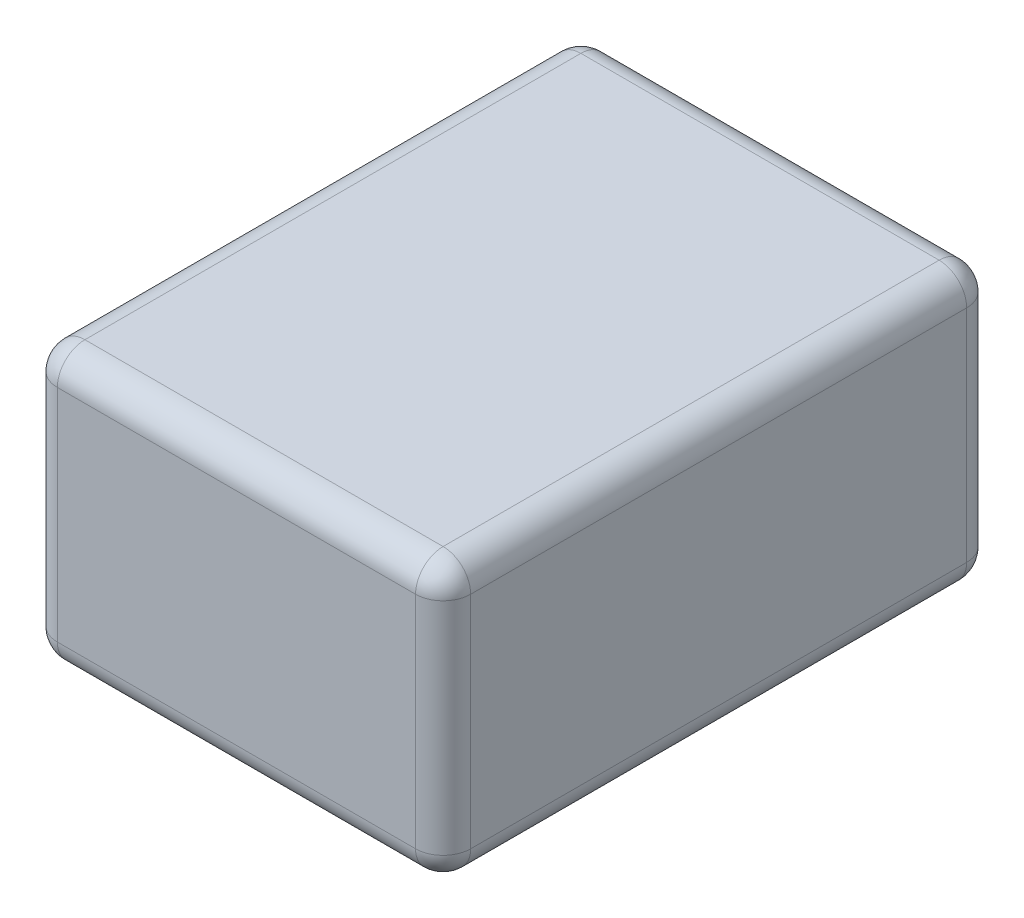
ISO-10303-21;
HEADER;
FILE_DESCRIPTION(('STEP AP214'),'2;1');
FILE_NAME('part.step','',(''),(''),'','','');
FILE_SCHEMA(('AUTOMOTIVE_DESIGN { 1 0 10303 214 1 1 1 1 }'));
ENDSEC;
DATA;
#1=APPLICATION_CONTEXT('core data for automotive mechanical design processes');
#2=APPLICATION_PROTOCOL_DEFINITION('international standard','automotive_design',2000,#1);
#3=PRODUCT_CONTEXT('',#1,'mechanical');
#4=PRODUCT('Part','Part','',(#3));
#5=PRODUCT_RELATED_PRODUCT_CATEGORY('part','',(#4));
#6=PRODUCT_DEFINITION_FORMATION('','',#4);
#7=PRODUCT_DEFINITION_CONTEXT('part definition',#1,'design');
#8=PRODUCT_DEFINITION('design','',#6,#7);
#9=PRODUCT_DEFINITION_SHAPE('','',#8);
#10=(LENGTH_UNIT() NAMED_UNIT(*) SI_UNIT(.MILLI.,.METRE.));
#11=(NAMED_UNIT(*) PLANE_ANGLE_UNIT() SI_UNIT($,.RADIAN.));
#12=(NAMED_UNIT(*) SI_UNIT($,.STERADIAN.) SOLID_ANGLE_UNIT());
#13=UNCERTAINTY_MEASURE_WITH_UNIT(LENGTH_MEASURE(1.E-05),#10,'distance_accuracy_value','');
#14=(GEOMETRIC_REPRESENTATION_CONTEXT(3) GLOBAL_UNCERTAINTY_ASSIGNED_CONTEXT((#13)) GLOBAL_UNIT_ASSIGNED_CONTEXT((#10,
#11,#12)) REPRESENTATION_CONTEXT('',''));
#15=CARTESIAN_POINT('',(0.,0.,0.));
#16=DIRECTION('',(0.,0.,1.));
#17=DIRECTION('',(1.,0.,0.));
#18=AXIS2_PLACEMENT_3D('',#15,#16,#17);
#19=CARTESIAN_POINT('',(15.,10.,40.));
#20=DIRECTION('',(-1.,0.,0.));
#21=DIRECTION('',(0.,0.,1.));
#22=AXIS2_PLACEMENT_3D('',#19,#20,#21);
#23=PLANE('',#22);
#24=DIRECTION('',(0.,1.,0.));
#25=VECTOR('',#24,1.);
#26=CARTESIAN_POINT('',(15.,-10.,38.));
#27=LINE('',#26,#25);
#28=CARTESIAN_POINT('',(15.,8.,38.));
#29=VERTEX_POINT('',#28);
#30=CARTESIAN_POINT('',(15.,-8.,38.));
#31=VERTEX_POINT('',#30);
#32=EDGE_CURVE('E136',#29,#31,#27,.F.);
#33=ORIENTED_EDGE('',*,*,#32,.T.);
#34=DIRECTION('',(0.,0.,-1.));
#35=VECTOR('',#34,1.);
#36=CARTESIAN_POINT('',(15.,-8.,40.));
#37=LINE('',#36,#35);
#38=CARTESIAN_POINT('',(15.,-8.,2.));
#39=VERTEX_POINT('',#38);
#40=EDGE_CURVE('E132',#31,#39,#37,.T.);
#41=ORIENTED_EDGE('',*,*,#40,.T.);
#42=DIRECTION('',(0.,1.,0.));
#43=VECTOR('',#42,1.);
#44=CARTESIAN_POINT('',(15.,10.,2.));
#45=LINE('',#44,#43);
#46=CARTESIAN_POINT('',(15.,8.,2.));
#47=VERTEX_POINT('',#46);
#48=EDGE_CURVE('E127',#39,#47,#45,.T.);
#49=ORIENTED_EDGE('',*,*,#48,.T.);
#50=DIRECTION('',(0.,0.,-1.));
#51=VECTOR('',#50,1.);
#52=CARTESIAN_POINT('',(15.,8.,40.));
#53=LINE('',#52,#51);
#54=EDGE_CURVE('E129',#47,#29,#53,.F.);
#55=ORIENTED_EDGE('',*,*,#54,.T.);
#56=EDGE_LOOP('',(#33,#41,#49,#55));
#57=FACE_BOUND('',#56,.T.);
#58=ADVANCED_FACE('F36',(#57),#23,.F.);
#59=CARTESIAN_POINT('',(-15.,10.,40.));
#60=DIRECTION('',(0.,-1.,0.));
#61=DIRECTION('',(0.,0.,-1.));
#62=AXIS2_PLACEMENT_3D('',#59,#60,#61);
#63=PLANE('',#62);
#64=DIRECTION('',(0.,0.,-1.));
#65=VECTOR('',#64,1.);
#66=CARTESIAN_POINT('',(13.,10.,40.));
#67=LINE('',#66,#65);
#68=CARTESIAN_POINT('',(13.,10.,38.));
#69=VERTEX_POINT('',#68);
#70=CARTESIAN_POINT('',(13.,10.,2.));
#71=VERTEX_POINT('',#70);
#72=EDGE_CURVE('E246',#69,#71,#67,.T.);
#73=ORIENTED_EDGE('',*,*,#72,.T.);
#74=DIRECTION('',(-1.,0.,0.));
#75=VECTOR('',#74,1.);
#76=CARTESIAN_POINT('',(-15.,10.,2.));
#77=LINE('',#76,#75);
#78=CARTESIAN_POINT('',(-13.,10.,2.));
#79=VERTEX_POINT('',#78);
#80=EDGE_CURVE('E11',#71,#79,#77,.T.);
#81=ORIENTED_EDGE('',*,*,#80,.T.);
#82=DIRECTION('',(0.,0.,-1.));
#83=VECTOR('',#82,1.);
#84=CARTESIAN_POINT('',(-13.,10.,40.));
#85=LINE('',#84,#83);
#86=CARTESIAN_POINT('',(-13.,10.,38.));
#87=VERTEX_POINT('',#86);
#88=EDGE_CURVE('E45',#79,#87,#85,.F.);
#89=ORIENTED_EDGE('',*,*,#88,.T.);
#90=DIRECTION('',(-1.,0.,0.));
#91=VECTOR('',#90,1.);
#92=CARTESIAN_POINT('',(15.,10.,38.));
#93=LINE('',#92,#91);
#94=EDGE_CURVE('E248',#87,#69,#93,.F.);
#95=ORIENTED_EDGE('',*,*,#94,.T.);
#96=EDGE_LOOP('',(#73,#81,#89,#95));
#97=FACE_BOUND('',#96,.T.);
#98=ADVANCED_FACE('F307',(#97),#63,.F.);
#99=CARTESIAN_POINT('',(-15.,10.,40.));
#100=DIRECTION('',(1.,0.,0.));
#101=DIRECTION('',(0.,0.,-1.));
#102=AXIS2_PLACEMENT_3D('',#99,#100,#101);
#103=PLANE('',#102);
#104=DIRECTION('',(0.,0.,-1.));
#105=VECTOR('',#104,1.);
#106=CARTESIAN_POINT('',(-15.,8.,40.));
#107=LINE('',#106,#105);
#108=CARTESIAN_POINT('',(-15.,8.,38.));
#109=VERTEX_POINT('',#108);
#110=CARTESIAN_POINT('',(-15.,8.,2.));
#111=VERTEX_POINT('',#110);
#112=EDGE_CURVE('E230',#109,#111,#107,.T.);
#113=ORIENTED_EDGE('',*,*,#112,.T.);
#114=DIRECTION('',(0.,-1.,0.));
#115=VECTOR('',#114,1.);
#116=CARTESIAN_POINT('',(-15.,10.,2.));
#117=LINE('',#116,#115);
#118=CARTESIAN_POINT('',(-15.,-8.,2.));
#119=VERTEX_POINT('',#118);
#120=EDGE_CURVE('E235',#111,#119,#117,.T.);
#121=ORIENTED_EDGE('',*,*,#120,.T.);
#122=DIRECTION('',(0.,0.,-1.));
#123=VECTOR('',#122,1.);
#124=CARTESIAN_POINT('',(-15.,-8.,40.));
#125=LINE('',#124,#123);
#126=CARTESIAN_POINT('',(-15.,-8.,38.));
#127=VERTEX_POINT('',#126);
#128=EDGE_CURVE('E233',#119,#127,#125,.F.);
#129=ORIENTED_EDGE('',*,*,#128,.T.);
#130=DIRECTION('',(0.,-1.,0.));
#131=VECTOR('',#130,1.);
#132=CARTESIAN_POINT('',(-15.,10.,38.));
#133=LINE('',#132,#131);
#134=EDGE_CURVE('E214',#127,#109,#133,.F.);
#135=ORIENTED_EDGE('',*,*,#134,.T.);
#136=EDGE_LOOP('',(#113,#121,#129,#135));
#137=FACE_BOUND('',#136,.T.);
#138=ADVANCED_FACE('F304',(#137),#103,.F.);
#139=CARTESIAN_POINT('',(-15.,-10.,40.));
#140=DIRECTION('',(0.,1.,0.));
#141=DIRECTION('',(0.,0.,1.));
#142=AXIS2_PLACEMENT_3D('',#139,#140,#141);
#143=PLANE('',#142);
#144=DIRECTION('',(1.,0.,0.));
#145=VECTOR('',#144,1.);
#146=CARTESIAN_POINT('',(-15.,-10.,2.));
#147=LINE('',#146,#145);
#148=CARTESIAN_POINT('',(-13.,-10.,2.));
#149=VERTEX_POINT('',#148);
#150=CARTESIAN_POINT('',(13.,-10.,2.));
#151=VERTEX_POINT('',#150);
#152=EDGE_CURVE('E277',#149,#151,#147,.T.);
#153=ORIENTED_EDGE('',*,*,#152,.T.);
#154=DIRECTION('',(0.,0.,-1.));
#155=VECTOR('',#154,1.);
#156=CARTESIAN_POINT('',(13.,-10.,40.));
#157=LINE('',#156,#155);
#158=CARTESIAN_POINT('',(13.,-10.,38.));
#159=VERTEX_POINT('',#158);
#160=EDGE_CURVE('E225',#151,#159,#157,.F.);
#161=ORIENTED_EDGE('',*,*,#160,.T.);
#162=DIRECTION('',(1.,0.,0.));
#163=VECTOR('',#162,1.);
#164=CARTESIAN_POINT('',(-15.,-10.,38.));
#165=LINE('',#164,#163);
#166=CARTESIAN_POINT('',(-13.,-10.,38.));
#167=VERTEX_POINT('',#166);
#168=EDGE_CURVE('E272',#159,#167,#165,.F.);
#169=ORIENTED_EDGE('',*,*,#168,.T.);
#170=DIRECTION('',(0.,0.,-1.));
#171=VECTOR('',#170,1.);
#172=CARTESIAN_POINT('',(-13.,-10.,40.));
#173=LINE('',#172,#171);
#174=EDGE_CURVE('E287',#167,#149,#173,.T.);
#175=ORIENTED_EDGE('',*,*,#174,.T.);
#176=EDGE_LOOP('',(#153,#161,#169,#175));
#177=FACE_BOUND('',#176,.T.);
#178=ADVANCED_FACE('F280',(#177),#143,.F.);
#179=CARTESIAN_POINT('',(0.,0.,40.));
#180=DIRECTION('',(0.,0.,1.));
#181=DIRECTION('',(1.,0.,0.));
#182=AXIS2_PLACEMENT_3D('',#179,#180,#181);
#183=PLANE('',#182);
#184=DIRECTION('',(0.,-1.,0.));
#185=VECTOR('',#184,1.);
#186=CARTESIAN_POINT('',(-13.,-10.,40.));
#187=LINE('',#186,#185);
#188=CARTESIAN_POINT('',(-13.,8.,40.));
#189=VERTEX_POINT('',#188);
#190=CARTESIAN_POINT('',(-13.,-8.,40.));
#191=VERTEX_POINT('',#190);
#192=EDGE_CURVE('E216',#189,#191,#187,.T.);
#193=ORIENTED_EDGE('',*,*,#192,.T.);
#194=DIRECTION('',(1.,0.,0.));
#195=VECTOR('',#194,1.);
#196=CARTESIAN_POINT('',(15.,-8.,40.));
#197=LINE('',#196,#195);
#198=CARTESIAN_POINT('',(13.,-8.,40.));
#199=VERTEX_POINT('',#198);
#200=EDGE_CURVE('E223',#191,#199,#197,.T.);
#201=ORIENTED_EDGE('',*,*,#200,.T.);
#202=DIRECTION('',(0.,1.,0.));
#203=VECTOR('',#202,1.);
#204=CARTESIAN_POINT('',(13.,10.,40.));
#205=LINE('',#204,#203);
#206=CARTESIAN_POINT('',(13.,8.,40.));
#207=VERTEX_POINT('',#206);
#208=EDGE_CURVE('E220',#199,#207,#205,.T.);
#209=ORIENTED_EDGE('',*,*,#208,.T.);
#210=DIRECTION('',(-1.,0.,0.));
#211=VECTOR('',#210,1.);
#212=CARTESIAN_POINT('',(-15.,8.,40.));
#213=LINE('',#212,#211);
#214=EDGE_CURVE('E221',#207,#189,#213,.T.);
#215=ORIENTED_EDGE('',*,*,#214,.T.);
#216=EDGE_LOOP('',(#193,#201,#209,#215));
#217=FACE_BOUND('',#216,.T.);
#218=ADVANCED_FACE('F294',(#217),#183,.T.);
#219=CARTESIAN_POINT('',(0.,0.,0.));
#220=DIRECTION('',(0.,0.,1.));
#221=DIRECTION('',(1.,0.,0.));
#222=AXIS2_PLACEMENT_3D('',#219,#220,#221);
#223=PLANE('',#222);
#224=DIRECTION('',(1.,0.,0.));
#225=VECTOR('',#224,1.);
#226=CARTESIAN_POINT('',(0.,-8.,0.));
#227=LINE('',#226,#225);
#228=CARTESIAN_POINT('',(13.,-8.,0.));
#229=VERTEX_POINT('',#228);
#230=CARTESIAN_POINT('',(-13.,-8.,0.));
#231=VERTEX_POINT('',#230);
#232=EDGE_CURVE('E241',#229,#231,#227,.F.);
#233=ORIENTED_EDGE('',*,*,#232,.T.);
#234=DIRECTION('',(0.,-1.,0.));
#235=VECTOR('',#234,1.);
#236=CARTESIAN_POINT('',(-13.,0.,0.));
#237=LINE('',#236,#235);
#238=CARTESIAN_POINT('',(-13.,8.,0.));
#239=VERTEX_POINT('',#238);
#240=EDGE_CURVE('E243',#231,#239,#237,.F.);
#241=ORIENTED_EDGE('',*,*,#240,.T.);
#242=DIRECTION('',(-1.,0.,0.));
#243=VECTOR('',#242,1.);
#244=CARTESIAN_POINT('',(0.,8.,0.));
#245=LINE('',#244,#243);
#246=CARTESIAN_POINT('',(13.,8.,0.));
#247=VERTEX_POINT('',#246);
#248=EDGE_CURVE('E239',#239,#247,#245,.F.);
#249=ORIENTED_EDGE('',*,*,#248,.T.);
#250=DIRECTION('',(0.,1.,0.));
#251=VECTOR('',#250,1.);
#252=CARTESIAN_POINT('',(13.,0.,0.));
#253=LINE('',#252,#251);
#254=EDGE_CURVE('E158',#247,#229,#253,.F.);
#255=ORIENTED_EDGE('',*,*,#254,.T.);
#256=EDGE_LOOP('',(#233,#241,#249,#255));
#257=FACE_BOUND('',#256,.T.);
#258=ADVANCED_FACE('F296',(#257),#223,.F.);
#259=CARTESIAN_POINT('',(-13.,8.,40.));
#260=DIRECTION('',(0.,0.,-1.));
#261=DIRECTION('',(-1.,0.,0.));
#262=AXIS2_PLACEMENT_3D('',#259,#260,#261);
#263=CYLINDRICAL_SURFACE('',#262,2.);
#264=CARTESIAN_POINT('',(-13.,8.,38.));
#265=DIRECTION('',(0.,0.,1.));
#266=DIRECTION('',(1.,0.,0.));
#267=AXIS2_PLACEMENT_3D('',#264,#265,#266);
#268=CIRCLE('',#267,2.);
#269=EDGE_CURVE('E40',#87,#109,#268,.T.);
#270=ORIENTED_EDGE('',*,*,#269,.F.);
#271=ORIENTED_EDGE('',*,*,#88,.F.);
#272=CARTESIAN_POINT('',(-13.,8.,2.));
#273=DIRECTION('',(0.,0.,-1.));
#274=DIRECTION('',(-1.,0.,0.));
#275=AXIS2_PLACEMENT_3D('',#272,#273,#274);
#276=CIRCLE('',#275,2.);
#277=EDGE_CURVE('E197',#111,#79,#276,.T.);
#278=ORIENTED_EDGE('',*,*,#277,.F.);
#279=ORIENTED_EDGE('',*,*,#112,.F.);
#280=EDGE_LOOP('',(#270,#271,#278,#279));
#281=FACE_BOUND('',#280,.T.);
#282=ADVANCED_FACE('F38',(#281),#263,.T.);
#283=CARTESIAN_POINT('',(-13.,8.,38.));
#284=DIRECTION('',(0.,0.,1.));
#285=DIRECTION('',(1.,0.,0.));
#286=AXIS2_PLACEMENT_3D('',#283,#284,#285);
#287=SPHERICAL_SURFACE('',#286,2.);
#288=CARTESIAN_POINT('',(-13.,8.,38.));
#289=DIRECTION('',(-1.,0.,0.));
#290=DIRECTION('',(0.,0.,1.));
#291=AXIS2_PLACEMENT_3D('',#288,#289,#290);
#292=CIRCLE('',#291,2.);
#293=EDGE_CURVE('E192',#87,#189,#292,.F.);
#294=ORIENTED_EDGE('',*,*,#293,.F.);
#295=ORIENTED_EDGE('',*,*,#269,.T.);
#296=CARTESIAN_POINT('',(-13.,8.,38.));
#297=DIRECTION('',(0.,1.,0.));
#298=DIRECTION('',(0.,0.,1.));
#299=AXIS2_PLACEMENT_3D('',#296,#297,#298);
#300=CIRCLE('',#299,2.);
#301=EDGE_CURVE('E195',#189,#109,#300,.F.);
#302=ORIENTED_EDGE('',*,*,#301,.F.);
#303=EDGE_LOOP('',(#294,#295,#302));
#304=FACE_BOUND('',#303,.T.);
#305=ADVANCED_FACE('F205',(#304),#287,.T.);
#306=CARTESIAN_POINT('',(-13.,8.,2.));
#307=DIRECTION('',(0.,0.,1.));
#308=DIRECTION('',(1.,0.,0.));
#309=AXIS2_PLACEMENT_3D('',#306,#307,#308);
#310=SPHERICAL_SURFACE('',#309,2.);
#311=CARTESIAN_POINT('',(-13.,8.,2.));
#312=DIRECTION('',(0.,1.,0.));
#313=DIRECTION('',(0.,0.,1.));
#314=AXIS2_PLACEMENT_3D('',#311,#312,#313);
#315=CIRCLE('',#314,2.);
#316=EDGE_CURVE('E188',#111,#239,#315,.F.);
#317=ORIENTED_EDGE('',*,*,#316,.F.);
#318=ORIENTED_EDGE('',*,*,#277,.T.);
#319=CARTESIAN_POINT('',(-13.,8.,2.));
#320=DIRECTION('',(-1.,0.,0.));
#321=DIRECTION('',(0.,0.,1.));
#322=AXIS2_PLACEMENT_3D('',#319,#320,#321);
#323=CIRCLE('',#322,2.);
#324=EDGE_CURVE('E53',#239,#79,#323,.F.);
#325=ORIENTED_EDGE('',*,*,#324,.F.);
#326=EDGE_LOOP('',(#317,#318,#325));
#327=FACE_BOUND('',#326,.T.);
#328=ADVANCED_FACE('F367',(#327),#310,.T.);
#329=CARTESIAN_POINT('',(-13.,0.,38.));
#330=DIRECTION('',(0.,1.,0.));
#331=DIRECTION('',(0.,0.,1.));
#332=AXIS2_PLACEMENT_3D('',#329,#330,#331);
#333=CYLINDRICAL_SURFACE('',#332,2.);
#334=ORIENTED_EDGE('',*,*,#301,.T.);
#335=ORIENTED_EDGE('',*,*,#134,.F.);
#336=CARTESIAN_POINT('',(-13.,-8.,38.));
#337=DIRECTION('',(0.,-1.,0.));
#338=DIRECTION('',(0.,0.,-1.));
#339=AXIS2_PLACEMENT_3D('',#336,#337,#338);
#340=CIRCLE('',#339,2.);
#341=EDGE_CURVE('E182',#191,#127,#340,.T.);
#342=ORIENTED_EDGE('',*,*,#341,.F.);
#343=ORIENTED_EDGE('',*,*,#192,.F.);
#344=EDGE_LOOP('',(#334,#335,#342,#343));
#345=FACE_BOUND('',#344,.T.);
#346=ADVANCED_FACE('F212',(#345),#333,.T.);
#347=CARTESIAN_POINT('',(0.,8.,38.));
#348=DIRECTION('',(1.,0.,0.));
#349=DIRECTION('',(0.,0.,-1.));
#350=AXIS2_PLACEMENT_3D('',#347,#348,#349);
#351=CYLINDRICAL_SURFACE('',#350,2.);
#352=ORIENTED_EDGE('',*,*,#293,.T.);
#353=ORIENTED_EDGE('',*,*,#214,.F.);
#354=CARTESIAN_POINT('',(13.,8.,38.));
#355=DIRECTION('',(1.,0.,0.));
#356=DIRECTION('',(0.,0.,-1.));
#357=AXIS2_PLACEMENT_3D('',#354,#355,#356);
#358=CIRCLE('',#357,2.);
#359=EDGE_CURVE('E179',#69,#207,#358,.T.);
#360=ORIENTED_EDGE('',*,*,#359,.F.);
#361=ORIENTED_EDGE('',*,*,#94,.F.);
#362=EDGE_LOOP('',(#352,#353,#360,#361));
#363=FACE_BOUND('',#362,.T.);
#364=ADVANCED_FACE('F361',(#363),#351,.T.);
#365=CARTESIAN_POINT('',(13.,8.,40.));
#366=DIRECTION('',(0.,0.,-1.));
#367=DIRECTION('',(-1.,0.,0.));
#368=AXIS2_PLACEMENT_3D('',#365,#366,#367);
#369=CYLINDRICAL_SURFACE('',#368,2.);
#370=CARTESIAN_POINT('',(13.,8.,2.));
#371=DIRECTION('',(0.,0.,-1.));
#372=DIRECTION('',(-1.,0.,0.));
#373=AXIS2_PLACEMENT_3D('',#370,#371,#372);
#374=CIRCLE('',#373,2.);
#375=EDGE_CURVE('E143',#71,#47,#374,.T.);
#376=ORIENTED_EDGE('',*,*,#375,.F.);
#377=ORIENTED_EDGE('',*,*,#72,.F.);
#378=CARTESIAN_POINT('',(13.,8.,38.));
#379=DIRECTION('',(0.,0.,1.));
#380=DIRECTION('',(1.,0.,0.));
#381=AXIS2_PLACEMENT_3D('',#378,#379,#380);
#382=CIRCLE('',#381,2.);
#383=EDGE_CURVE('E146',#29,#69,#382,.T.);
#384=ORIENTED_EDGE('',*,*,#383,.F.);
#385=ORIENTED_EDGE('',*,*,#54,.F.);
#386=EDGE_LOOP('',(#376,#377,#384,#385));
#387=FACE_BOUND('',#386,.T.);
#388=ADVANCED_FACE('F141',(#387),#369,.T.);
#389=CARTESIAN_POINT('',(-15.,8.,2.));
#390=DIRECTION('',(-1.,0.,0.));
#391=DIRECTION('',(0.,0.,1.));
#392=AXIS2_PLACEMENT_3D('',#389,#390,#391);
#393=CYLINDRICAL_SURFACE('',#392,2.);
#394=ORIENTED_EDGE('',*,*,#324,.T.);
#395=ORIENTED_EDGE('',*,*,#80,.F.);
#396=CARTESIAN_POINT('',(13.,8.,2.));
#397=DIRECTION('',(1.,0.,0.));
#398=DIRECTION('',(0.,1.,0.));
#399=AXIS2_PLACEMENT_3D('',#396,#397,#398);
#400=CIRCLE('',#399,2.);
#401=EDGE_CURVE('E155',#247,#71,#400,.T.);
#402=ORIENTED_EDGE('',*,*,#401,.F.);
#403=ORIENTED_EDGE('',*,*,#248,.F.);
#404=EDGE_LOOP('',(#394,#395,#402,#403));
#405=FACE_BOUND('',#404,.T.);
#406=ADVANCED_FACE('F355',(#405),#393,.T.);
#407=CARTESIAN_POINT('',(-13.,10.,2.));
#408=DIRECTION('',(0.,-1.,0.));
#409=DIRECTION('',(0.,0.,-1.));
#410=AXIS2_PLACEMENT_3D('',#407,#408,#409);
#411=CYLINDRICAL_SURFACE('',#410,2.);
#412=ORIENTED_EDGE('',*,*,#316,.T.);
#413=ORIENTED_EDGE('',*,*,#240,.F.);
#414=CARTESIAN_POINT('',(-13.,-8.,2.));
#415=DIRECTION('',(0.,-1.,0.));
#416=DIRECTION('',(0.,0.,-1.));
#417=AXIS2_PLACEMENT_3D('',#414,#415,#416);
#418=CIRCLE('',#417,2.);
#419=EDGE_CURVE('E174',#119,#231,#418,.T.);
#420=ORIENTED_EDGE('',*,*,#419,.F.);
#421=ORIENTED_EDGE('',*,*,#120,.F.);
#422=EDGE_LOOP('',(#412,#413,#420,#421));
#423=FACE_BOUND('',#422,.T.);
#424=ADVANCED_FACE('F351',(#423),#411,.T.);
#425=CARTESIAN_POINT('',(-13.,-8.,40.));
#426=DIRECTION('',(0.,0.,-1.));
#427=DIRECTION('',(-1.,0.,0.));
#428=AXIS2_PLACEMENT_3D('',#425,#426,#427);
#429=CYLINDRICAL_SURFACE('',#428,2.);
#430=CARTESIAN_POINT('',(-13.,-8.,38.));
#431=DIRECTION('',(0.,0.,1.));
#432=DIRECTION('',(1.,0.,0.));
#433=AXIS2_PLACEMENT_3D('',#430,#431,#432);
#434=CIRCLE('',#433,2.);
#435=EDGE_CURVE('E185',#127,#167,#434,.T.);
#436=ORIENTED_EDGE('',*,*,#435,.F.);
#437=ORIENTED_EDGE('',*,*,#128,.F.);
#438=CARTESIAN_POINT('',(-13.,-8.,2.));
#439=DIRECTION('',(0.,0.,-1.));
#440=DIRECTION('',(-1.,0.,0.));
#441=AXIS2_PLACEMENT_3D('',#438,#439,#440);
#442=CIRCLE('',#441,2.);
#443=EDGE_CURVE('E172',#149,#119,#442,.T.);
#444=ORIENTED_EDGE('',*,*,#443,.F.);
#445=ORIENTED_EDGE('',*,*,#174,.F.);
#446=EDGE_LOOP('',(#436,#437,#444,#445));
#447=FACE_BOUND('',#446,.T.);
#448=ADVANCED_FACE('F347',(#447),#429,.T.);
#449=CARTESIAN_POINT('',(-13.,-8.,38.));
#450=DIRECTION('',(0.,0.,1.));
#451=DIRECTION('',(1.,0.,0.));
#452=AXIS2_PLACEMENT_3D('',#449,#450,#451);
#453=SPHERICAL_SURFACE('',#452,2.);
#454=ORIENTED_EDGE('',*,*,#341,.T.);
#455=ORIENTED_EDGE('',*,*,#435,.T.);
#456=CARTESIAN_POINT('',(-13.,-8.,38.));
#457=DIRECTION('',(-1.,0.,0.));
#458=DIRECTION('',(0.,0.,1.));
#459=AXIS2_PLACEMENT_3D('',#456,#457,#458);
#460=CIRCLE('',#459,2.);
#461=EDGE_CURVE('E163',#191,#167,#460,.F.);
#462=ORIENTED_EDGE('',*,*,#461,.F.);
#463=EDGE_LOOP('',(#454,#455,#462));
#464=FACE_BOUND('',#463,.T.);
#465=ADVANCED_FACE('F343',(#464),#453,.T.);
#466=CARTESIAN_POINT('',(13.,8.,38.));
#467=DIRECTION('',(0.,0.,1.));
#468=DIRECTION('',(1.,0.,0.));
#469=AXIS2_PLACEMENT_3D('',#466,#467,#468);
#470=SPHERICAL_SURFACE('',#469,2.);
#471=ORIENTED_EDGE('',*,*,#383,.T.);
#472=ORIENTED_EDGE('',*,*,#359,.T.);
#473=CARTESIAN_POINT('',(13.,8.,38.));
#474=DIRECTION('',(0.,1.,0.));
#475=DIRECTION('',(0.,0.,1.));
#476=AXIS2_PLACEMENT_3D('',#473,#474,#475);
#477=CIRCLE('',#476,2.);
#478=EDGE_CURVE('E159',#29,#207,#477,.F.);
#479=ORIENTED_EDGE('',*,*,#478,.F.);
#480=EDGE_LOOP('',(#471,#472,#479));
#481=FACE_BOUND('',#480,.T.);
#482=ADVANCED_FACE('F340',(#481),#470,.T.);
#483=CARTESIAN_POINT('',(13.,8.,2.));
#484=DIRECTION('',(0.,0.,1.));
#485=DIRECTION('',(1.,0.,0.));
#486=AXIS2_PLACEMENT_3D('',#483,#484,#485);
#487=SPHERICAL_SURFACE('',#486,2.);
#488=ORIENTED_EDGE('',*,*,#401,.T.);
#489=ORIENTED_EDGE('',*,*,#375,.T.);
#490=CARTESIAN_POINT('',(13.,8.,2.));
#491=DIRECTION('',(0.,1.,0.));
#492=DIRECTION('',(0.,0.,1.));
#493=AXIS2_PLACEMENT_3D('',#490,#491,#492);
#494=CIRCLE('',#493,2.);
#495=EDGE_CURVE('E152',#247,#47,#494,.F.);
#496=ORIENTED_EDGE('',*,*,#495,.F.);
#497=EDGE_LOOP('',(#488,#489,#496));
#498=FACE_BOUND('',#497,.T.);
#499=ADVANCED_FACE('F151',(#498),#487,.T.);
#500=CARTESIAN_POINT('',(-13.,-8.,2.));
#501=DIRECTION('',(0.,0.,1.));
#502=DIRECTION('',(1.,0.,0.));
#503=AXIS2_PLACEMENT_3D('',#500,#501,#502);
#504=SPHERICAL_SURFACE('',#503,2.);
#505=ORIENTED_EDGE('',*,*,#443,.T.);
#506=ORIENTED_EDGE('',*,*,#419,.T.);
#507=CARTESIAN_POINT('',(-13.,-8.,2.));
#508=DIRECTION('',(-1.,0.,0.));
#509=DIRECTION('',(0.,0.,1.));
#510=AXIS2_PLACEMENT_3D('',#507,#508,#509);
#511=CIRCLE('',#510,2.);
#512=EDGE_CURVE('E160',#149,#231,#511,.F.);
#513=ORIENTED_EDGE('',*,*,#512,.F.);
#514=EDGE_LOOP('',(#505,#506,#513));
#515=FACE_BOUND('',#514,.T.);
#516=ADVANCED_FACE('F334',(#515),#504,.T.);
#517=CARTESIAN_POINT('',(0.,-8.,38.));
#518=DIRECTION('',(-1.,0.,0.));
#519=DIRECTION('',(0.,0.,1.));
#520=AXIS2_PLACEMENT_3D('',#517,#518,#519);
#521=CYLINDRICAL_SURFACE('',#520,2.);
#522=ORIENTED_EDGE('',*,*,#461,.T.);
#523=ORIENTED_EDGE('',*,*,#168,.F.);
#524=CARTESIAN_POINT('',(13.,-8.,38.));
#525=DIRECTION('',(1.,0.,0.));
#526=DIRECTION('',(0.,0.,-1.));
#527=AXIS2_PLACEMENT_3D('',#524,#525,#526);
#528=CIRCLE('',#527,2.);
#529=EDGE_CURVE('E166',#199,#159,#528,.T.);
#530=ORIENTED_EDGE('',*,*,#529,.F.);
#531=ORIENTED_EDGE('',*,*,#200,.F.);
#532=EDGE_LOOP('',(#522,#523,#530,#531));
#533=FACE_BOUND('',#532,.T.);
#534=ADVANCED_FACE('F274',(#533),#521,.T.);
#535=CARTESIAN_POINT('',(13.,0.,38.));
#536=DIRECTION('',(0.,-1.,0.));
#537=DIRECTION('',(0.,0.,-1.));
#538=AXIS2_PLACEMENT_3D('',#535,#536,#537);
#539=CYLINDRICAL_SURFACE('',#538,2.);
#540=ORIENTED_EDGE('',*,*,#478,.T.);
#541=ORIENTED_EDGE('',*,*,#208,.F.);
#542=CARTESIAN_POINT('',(13.,-8.,38.));
#543=DIRECTION('',(0.,-1.,0.));
#544=DIRECTION('',(0.,0.,-1.));
#545=AXIS2_PLACEMENT_3D('',#542,#543,#544);
#546=CIRCLE('',#545,2.);
#547=EDGE_CURVE('E261',#31,#199,#546,.T.);
#548=ORIENTED_EDGE('',*,*,#547,.F.);
#549=ORIENTED_EDGE('',*,*,#32,.F.);
#550=EDGE_LOOP('',(#540,#541,#548,#549));
#551=FACE_BOUND('',#550,.T.);
#552=ADVANCED_FACE('F292',(#551),#539,.T.);
#553=CARTESIAN_POINT('',(13.,10.,2.));
#554=DIRECTION('',(0.,1.,0.));
#555=DIRECTION('',(0.,0.,1.));
#556=AXIS2_PLACEMENT_3D('',#553,#554,#555);
#557=CYLINDRICAL_SURFACE('',#556,2.);
#558=ORIENTED_EDGE('',*,*,#495,.T.);
#559=ORIENTED_EDGE('',*,*,#48,.F.);
#560=CARTESIAN_POINT('',(13.,-8.,2.));
#561=DIRECTION('',(0.,-1.,0.));
#562=DIRECTION('',(0.,0.,-1.));
#563=AXIS2_PLACEMENT_3D('',#560,#561,#562);
#564=CIRCLE('',#563,2.);
#565=EDGE_CURVE('E258',#229,#39,#564,.T.);
#566=ORIENTED_EDGE('',*,*,#565,.F.);
#567=ORIENTED_EDGE('',*,*,#254,.F.);
#568=EDGE_LOOP('',(#558,#559,#566,#567));
#569=FACE_BOUND('',#568,.T.);
#570=ADVANCED_FACE('F157',(#569),#557,.T.);
#571=CARTESIAN_POINT('',(-15.,-8.,2.));
#572=DIRECTION('',(1.,0.,0.));
#573=DIRECTION('',(0.,0.,-1.));
#574=AXIS2_PLACEMENT_3D('',#571,#572,#573);
#575=CYLINDRICAL_SURFACE('',#574,2.);
#576=ORIENTED_EDGE('',*,*,#512,.T.);
#577=ORIENTED_EDGE('',*,*,#232,.F.);
#578=CARTESIAN_POINT('',(13.,-8.,2.));
#579=DIRECTION('',(1.,0.,0.));
#580=DIRECTION('',(0.,0.,-1.));
#581=AXIS2_PLACEMENT_3D('',#578,#579,#580);
#582=CIRCLE('',#581,2.);
#583=EDGE_CURVE('E255',#151,#229,#582,.T.);
#584=ORIENTED_EDGE('',*,*,#583,.F.);
#585=ORIENTED_EDGE('',*,*,#152,.F.);
#586=EDGE_LOOP('',(#576,#577,#584,#585));
#587=FACE_BOUND('',#586,.T.);
#588=ADVANCED_FACE('F324',(#587),#575,.T.);
#589=CARTESIAN_POINT('',(13.,-8.,38.));
#590=DIRECTION('',(0.,0.,1.));
#591=DIRECTION('',(1.,0.,0.));
#592=AXIS2_PLACEMENT_3D('',#589,#590,#591);
#593=SPHERICAL_SURFACE('',#592,2.);
#594=ORIENTED_EDGE('',*,*,#547,.T.);
#595=ORIENTED_EDGE('',*,*,#529,.T.);
#596=CARTESIAN_POINT('',(13.,-8.,38.));
#597=DIRECTION('',(0.,0.,1.));
#598=DIRECTION('',(1.,0.,0.));
#599=AXIS2_PLACEMENT_3D('',#596,#597,#598);
#600=CIRCLE('',#599,2.);
#601=EDGE_CURVE('E253',#31,#159,#600,.F.);
#602=ORIENTED_EDGE('',*,*,#601,.F.);
#603=EDGE_LOOP('',(#594,#595,#602));
#604=FACE_BOUND('',#603,.T.);
#605=ADVANCED_FACE('F267',(#604),#593,.T.);
#606=CARTESIAN_POINT('',(13.,-8.,2.));
#607=DIRECTION('',(0.,0.,1.));
#608=DIRECTION('',(1.,0.,0.));
#609=AXIS2_PLACEMENT_3D('',#606,#607,#608);
#610=SPHERICAL_SURFACE('',#609,2.);
#611=ORIENTED_EDGE('',*,*,#583,.T.);
#612=ORIENTED_EDGE('',*,*,#565,.T.);
#613=CARTESIAN_POINT('',(13.,-8.,2.));
#614=DIRECTION('',(0.,0.,-1.));
#615=DIRECTION('',(-1.,0.,0.));
#616=AXIS2_PLACEMENT_3D('',#613,#614,#615);
#617=CIRCLE('',#616,2.);
#618=EDGE_CURVE('E251',#151,#39,#617,.F.);
#619=ORIENTED_EDGE('',*,*,#618,.F.);
#620=EDGE_LOOP('',(#611,#612,#619));
#621=FACE_BOUND('',#620,.T.);
#622=ADVANCED_FACE('F318',(#621),#610,.T.);
#623=CARTESIAN_POINT('',(13.,-8.,40.));
#624=DIRECTION('',(0.,0.,-1.));
#625=DIRECTION('',(-1.,0.,0.));
#626=AXIS2_PLACEMENT_3D('',#623,#624,#625);
#627=CYLINDRICAL_SURFACE('',#626,2.);
#628=ORIENTED_EDGE('',*,*,#601,.T.);
#629=ORIENTED_EDGE('',*,*,#160,.F.);
#630=ORIENTED_EDGE('',*,*,#618,.T.);
#631=ORIENTED_EDGE('',*,*,#40,.F.);
#632=EDGE_LOOP('',(#628,#629,#630,#631));
#633=FACE_BOUND('',#632,.T.);
#634=ADVANCED_FACE('F315',(#633),#627,.T.);
#635=CLOSED_SHELL('',(#58,#98,#138,#178,#218,#258,#282,#305,#328,#346,#364,#388,#406,#424,#448,
#465,#482,#499,#516,#534,#552,#570,#588,#605,#622,#634));
#636=MANIFOLD_SOLID_BREP('B2',#635);
#637=ADVANCED_BREP_SHAPE_REPRESENTATION('',(#18,#636),#14);
#638=SHAPE_DEFINITION_REPRESENTATION(#9,#637);
ENDSEC;
END-ISO-10303-21;
